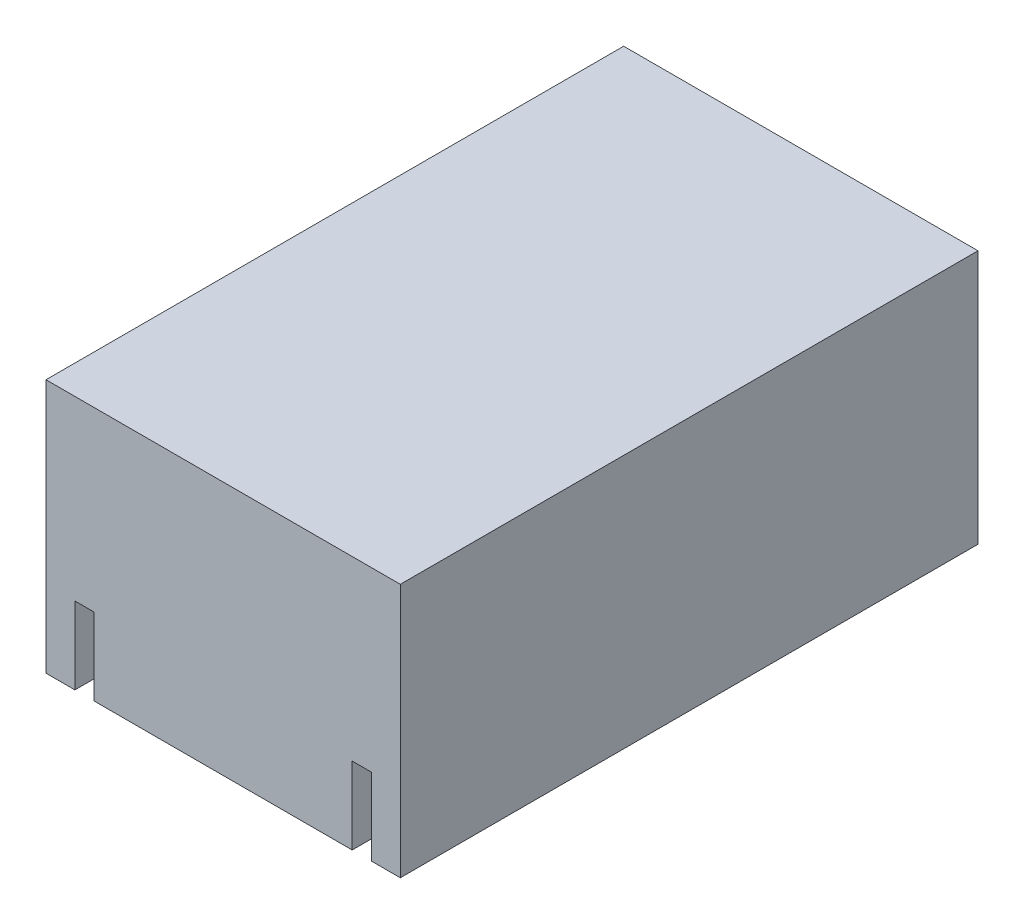
ISO-10303-21;
HEADER;
FILE_DESCRIPTION(('STEP AP214'),'2;1');
FILE_NAME('part.step','',(''),(''),'','','');
FILE_SCHEMA(('AUTOMOTIVE_DESIGN { 1 0 10303 214 1 1 1 1 }'));
ENDSEC;
DATA;
#1=APPLICATION_CONTEXT('core data for automotive mechanical design processes');
#2=APPLICATION_PROTOCOL_DEFINITION('international standard','automotive_design',2000,#1);
#3=PRODUCT_CONTEXT('',#1,'mechanical');
#4=PRODUCT('Part','Part','',(#3));
#5=PRODUCT_RELATED_PRODUCT_CATEGORY('part','',(#4));
#6=PRODUCT_DEFINITION_FORMATION('','',#4);
#7=PRODUCT_DEFINITION_CONTEXT('part definition',#1,'design');
#8=PRODUCT_DEFINITION('design','',#6,#7);
#9=PRODUCT_DEFINITION_SHAPE('','',#8);
#10=(LENGTH_UNIT() NAMED_UNIT(*) SI_UNIT(.MILLI.,.METRE.));
#11=(NAMED_UNIT(*) PLANE_ANGLE_UNIT() SI_UNIT($,.RADIAN.));
#12=(NAMED_UNIT(*) SI_UNIT($,.STERADIAN.) SOLID_ANGLE_UNIT());
#13=UNCERTAINTY_MEASURE_WITH_UNIT(LENGTH_MEASURE(1.E-05),#10,'distance_accuracy_value','');
#14=(GEOMETRIC_REPRESENTATION_CONTEXT(3) GLOBAL_UNCERTAINTY_ASSIGNED_CONTEXT((#13)) GLOBAL_UNIT_ASSIGNED_CONTEXT((#10,
#11,#12)) REPRESENTATION_CONTEXT('',''));
#15=CARTESIAN_POINT('',(0.,0.,0.));
#16=DIRECTION('',(0.,0.,1.));
#17=DIRECTION('',(1.,0.,0.));
#18=AXIS2_PLACEMENT_3D('',#15,#16,#17);
#19=CARTESIAN_POINT('',(23.,-16.5,75.));
#20=DIRECTION('',(0.,1.,0.));
#21=DIRECTION('',(-1.,0.,0.));
#22=AXIS2_PLACEMENT_3D('',#19,#20,#21);
#23=PLANE('',#22);
#24=DIRECTION('',(1.,0.,0.));
#25=VECTOR('',#24,1.);
#26=CARTESIAN_POINT('',(23.,-16.5,0.));
#27=LINE('',#26,#25);
#28=CARTESIAN_POINT('',(-16.75,-16.5,0.));
#29=VERTEX_POINT('',#28);
#30=CARTESIAN_POINT('',(16.75,-16.5,0.));
#31=VERTEX_POINT('',#30);
#32=EDGE_CURVE('E138',#29,#31,#27,.T.);
#33=ORIENTED_EDGE('',*,*,#32,.T.);
#34=DIRECTION('',(0.,0.,1.));
#35=VECTOR('',#34,1.);
#36=CARTESIAN_POINT('',(16.75,-16.5,0.));
#37=LINE('',#36,#35);
#38=CARTESIAN_POINT('',(16.75,-16.5,75.));
#39=VERTEX_POINT('',#38);
#40=EDGE_CURVE('E122',#31,#39,#37,.T.);
#41=ORIENTED_EDGE('',*,*,#40,.T.);
#42=DIRECTION('',(1.,0.,0.));
#43=VECTOR('',#42,1.);
#44=CARTESIAN_POINT('',(23.,-16.5,75.));
#45=LINE('',#44,#43);
#46=CARTESIAN_POINT('',(-16.75,-16.5,75.));
#47=VERTEX_POINT('',#46);
#48=EDGE_CURVE('E190',#47,#39,#45,.T.);
#49=ORIENTED_EDGE('',*,*,#48,.F.);
#50=DIRECTION('',(0.,0.,1.));
#51=VECTOR('',#50,1.);
#52=CARTESIAN_POINT('',(-16.75,-16.5,0.));
#53=LINE('',#52,#51);
#54=EDGE_CURVE('E144',#29,#47,#53,.T.);
#55=ORIENTED_EDGE('',*,*,#54,.F.);
#56=EDGE_LOOP('',(#33,#41,#49,#55));
#57=FACE_BOUND('',#56,.T.);
#58=ADVANCED_FACE('F33',(#57),#23,.F.);
#59=CARTESIAN_POINT('',(19.25,-16.5,75.));
#60=VERTEX_POINT('',#59);
#61=CARTESIAN_POINT('',(23.,-16.5,75.));
#62=VERTEX_POINT('',#61);
#63=EDGE_CURVE('E188',#60,#62,#45,.T.);
#64=ORIENTED_EDGE('',*,*,#63,.F.);
#65=DIRECTION('',(0.,0.,1.));
#66=VECTOR('',#65,1.);
#67=CARTESIAN_POINT('',(19.25,-16.5,0.));
#68=LINE('',#67,#66);
#69=CARTESIAN_POINT('',(19.25,-16.5,0.));
#70=VERTEX_POINT('',#69);
#71=EDGE_CURVE('E132',#70,#60,#68,.T.);
#72=ORIENTED_EDGE('',*,*,#71,.F.);
#73=CARTESIAN_POINT('',(23.,-16.5,0.));
#74=VERTEX_POINT('',#73);
#75=EDGE_CURVE('E146',#70,#74,#27,.T.);
#76=ORIENTED_EDGE('',*,*,#75,.T.);
#77=DIRECTION('',(0.,0.,-1.));
#78=VECTOR('',#77,1.);
#79=CARTESIAN_POINT('',(23.,-16.5,75.));
#80=LINE('',#79,#78);
#81=EDGE_CURVE('E41',#62,#74,#80,.T.);
#82=ORIENTED_EDGE('',*,*,#81,.F.);
#83=EDGE_LOOP('',(#64,#72,#76,#82));
#84=FACE_BOUND('',#83,.T.);
#85=ADVANCED_FACE('F203',(#84),#23,.F.);
#86=CARTESIAN_POINT('',(-23.,-16.5,75.));
#87=DIRECTION('',(1.,0.,0.));
#88=DIRECTION('',(0.,0.,-1.));
#89=AXIS2_PLACEMENT_3D('',#86,#87,#88);
#90=PLANE('',#89);
#91=DIRECTION('',(0.,-1.,0.));
#92=VECTOR('',#91,1.);
#93=CARTESIAN_POINT('',(-23.,-16.5,0.));
#94=LINE('',#93,#92);
#95=CARTESIAN_POINT('',(-23.,16.5,0.));
#96=VERTEX_POINT('',#95);
#97=CARTESIAN_POINT('',(-23.,-16.5,0.));
#98=VERTEX_POINT('',#97);
#99=EDGE_CURVE('E150',#96,#98,#94,.T.);
#100=ORIENTED_EDGE('',*,*,#99,.T.);
#101=DIRECTION('',(0.,0.,-1.));
#102=VECTOR('',#101,1.);
#103=CARTESIAN_POINT('',(-23.,-16.5,75.));
#104=LINE('',#103,#102);
#105=CARTESIAN_POINT('',(-23.,-16.5,75.));
#106=VERTEX_POINT('',#105);
#107=EDGE_CURVE('E11',#106,#98,#104,.T.);
#108=ORIENTED_EDGE('',*,*,#107,.F.);
#109=DIRECTION('',(0.,-1.,0.));
#110=VECTOR('',#109,1.);
#111=CARTESIAN_POINT('',(-23.,-16.5,75.));
#112=LINE('',#111,#110);
#113=CARTESIAN_POINT('',(-23.,16.5,75.));
#114=VERTEX_POINT('',#113);
#115=EDGE_CURVE('E157',#114,#106,#112,.T.);
#116=ORIENTED_EDGE('',*,*,#115,.F.);
#117=DIRECTION('',(0.,0.,-1.));
#118=VECTOR('',#117,1.);
#119=CARTESIAN_POINT('',(-23.,16.5,75.));
#120=LINE('',#119,#118);
#121=EDGE_CURVE('E158',#114,#96,#120,.T.);
#122=ORIENTED_EDGE('',*,*,#121,.T.);
#123=EDGE_LOOP('',(#100,#108,#116,#122));
#124=FACE_BOUND('',#123,.T.);
#125=ADVANCED_FACE('F35',(#124),#90,.F.);
#126=CARTESIAN_POINT('',(-19.25,-16.5,0.));
#127=VERTEX_POINT('',#126);
#128=EDGE_CURVE('E145',#98,#127,#27,.T.);
#129=ORIENTED_EDGE('',*,*,#128,.T.);
#130=DIRECTION('',(0.,0.,1.));
#131=VECTOR('',#130,1.);
#132=CARTESIAN_POINT('',(-19.25,-16.5,0.));
#133=LINE('',#132,#131);
#134=CARTESIAN_POINT('',(-19.25,-16.5,75.));
#135=VERTEX_POINT('',#134);
#136=EDGE_CURVE('E226',#127,#135,#133,.T.);
#137=ORIENTED_EDGE('',*,*,#136,.T.);
#138=EDGE_CURVE('E192',#106,#135,#45,.T.);
#139=ORIENTED_EDGE('',*,*,#138,.F.);
#140=ORIENTED_EDGE('',*,*,#107,.T.);
#141=EDGE_LOOP('',(#129,#137,#139,#140));
#142=FACE_BOUND('',#141,.T.);
#143=ADVANCED_FACE('F239',(#142),#23,.F.);
#144=CARTESIAN_POINT('',(23.,-16.5,75.));
#145=DIRECTION('',(-1.,0.,0.));
#146=DIRECTION('',(0.,-1.,0.));
#147=AXIS2_PLACEMENT_3D('',#144,#145,#146);
#148=PLANE('',#147);
#149=DIRECTION('',(0.,1.,0.));
#150=VECTOR('',#149,1.);
#151=CARTESIAN_POINT('',(23.,-16.5,0.));
#152=LINE('',#151,#150);
#153=CARTESIAN_POINT('',(23.,16.5,0.));
#154=VERTEX_POINT('',#153);
#155=EDGE_CURVE('E149',#74,#154,#152,.T.);
#156=ORIENTED_EDGE('',*,*,#155,.T.);
#157=DIRECTION('',(0.,0.,-1.));
#158=VECTOR('',#157,1.);
#159=CARTESIAN_POINT('',(23.,16.5,75.));
#160=LINE('',#159,#158);
#161=CARTESIAN_POINT('',(23.,16.5,75.));
#162=VERTEX_POINT('',#161);
#163=EDGE_CURVE('E161',#162,#154,#160,.T.);
#164=ORIENTED_EDGE('',*,*,#163,.F.);
#165=DIRECTION('',(0.,1.,0.));
#166=VECTOR('',#165,1.);
#167=CARTESIAN_POINT('',(23.,-16.5,75.));
#168=LINE('',#167,#166);
#169=EDGE_CURVE('E171',#62,#162,#168,.T.);
#170=ORIENTED_EDGE('',*,*,#169,.F.);
#171=ORIENTED_EDGE('',*,*,#81,.T.);
#172=EDGE_LOOP('',(#156,#164,#170,#171));
#173=FACE_BOUND('',#172,.T.);
#174=ADVANCED_FACE('F169',(#173),#148,.F.);
#175=CARTESIAN_POINT('',(23.,16.5,75.));
#176=DIRECTION('',(0.,-1.,0.));
#177=DIRECTION('',(1.,0.,0.));
#178=AXIS2_PLACEMENT_3D('',#175,#176,#177);
#179=PLANE('',#178);
#180=DIRECTION('',(-1.,0.,0.));
#181=VECTOR('',#180,1.);
#182=CARTESIAN_POINT('',(23.,16.5,0.));
#183=LINE('',#182,#181);
#184=EDGE_CURVE('E155',#154,#96,#183,.T.);
#185=ORIENTED_EDGE('',*,*,#184,.T.);
#186=ORIENTED_EDGE('',*,*,#121,.F.);
#187=DIRECTION('',(-1.,0.,0.));
#188=VECTOR('',#187,1.);
#189=CARTESIAN_POINT('',(23.,16.5,75.));
#190=LINE('',#189,#188);
#191=EDGE_CURVE('E162',#162,#114,#190,.T.);
#192=ORIENTED_EDGE('',*,*,#191,.F.);
#193=ORIENTED_EDGE('',*,*,#163,.T.);
#194=EDGE_LOOP('',(#185,#186,#192,#193));
#195=FACE_BOUND('',#194,.T.);
#196=ADVANCED_FACE('F180',(#195),#179,.F.);
#197=CARTESIAN_POINT('',(0.,0.,75.));
#198=DIRECTION('',(0.,0.,1.));
#199=DIRECTION('',(1.,0.,0.));
#200=AXIS2_PLACEMENT_3D('',#197,#198,#199);
#201=PLANE('',#200);
#202=DIRECTION('',(0.,-1.,0.));
#203=VECTOR('',#202,1.);
#204=CARTESIAN_POINT('',(16.75,-16.5,75.));
#205=LINE('',#204,#203);
#206=CARTESIAN_POINT('',(16.75,-6.5,75.));
#207=VERTEX_POINT('',#206);
#208=EDGE_CURVE('E127',#207,#39,#205,.T.);
#209=ORIENTED_EDGE('',*,*,#208,.F.);
#210=DIRECTION('',(-1.,0.,0.));
#211=VECTOR('',#210,1.);
#212=CARTESIAN_POINT('',(16.75,-6.5,75.));
#213=LINE('',#212,#211);
#214=CARTESIAN_POINT('',(19.25,-6.5,75.));
#215=VERTEX_POINT('',#214);
#216=EDGE_CURVE('E141',#215,#207,#213,.T.);
#217=ORIENTED_EDGE('',*,*,#216,.F.);
#218=DIRECTION('',(0.,1.,0.));
#219=VECTOR('',#218,1.);
#220=CARTESIAN_POINT('',(19.25,-16.5,75.));
#221=LINE('',#220,#219);
#222=EDGE_CURVE('E201',#60,#215,#221,.T.);
#223=ORIENTED_EDGE('',*,*,#222,.F.);
#224=ORIENTED_EDGE('',*,*,#63,.T.);
#225=ORIENTED_EDGE('',*,*,#169,.T.);
#226=ORIENTED_EDGE('',*,*,#191,.T.);
#227=ORIENTED_EDGE('',*,*,#115,.T.);
#228=ORIENTED_EDGE('',*,*,#138,.T.);
#229=DIRECTION('',(0.,-1.,0.));
#230=VECTOR('',#229,1.);
#231=CARTESIAN_POINT('',(-19.25,-16.5,75.));
#232=LINE('',#231,#230);
#233=CARTESIAN_POINT('',(-19.25,-6.5,75.));
#234=VERTEX_POINT('',#233);
#235=EDGE_CURVE('E214',#234,#135,#232,.T.);
#236=ORIENTED_EDGE('',*,*,#235,.F.);
#237=DIRECTION('',(-1.,0.,0.));
#238=VECTOR('',#237,1.);
#239=CARTESIAN_POINT('',(-16.75,-6.5,75.));
#240=LINE('',#239,#238);
#241=CARTESIAN_POINT('',(-16.75,-6.5,75.));
#242=VERTEX_POINT('',#241);
#243=EDGE_CURVE('E221',#242,#234,#240,.T.);
#244=ORIENTED_EDGE('',*,*,#243,.F.);
#245=DIRECTION('',(0.,1.,0.));
#246=VECTOR('',#245,1.);
#247=CARTESIAN_POINT('',(-16.75,-16.5,75.));
#248=LINE('',#247,#246);
#249=EDGE_CURVE('E218',#47,#242,#248,.T.);
#250=ORIENTED_EDGE('',*,*,#249,.F.);
#251=ORIENTED_EDGE('',*,*,#48,.T.);
#252=EDGE_LOOP('',(#209,#217,#223,#224,#225,#226,#227,#228,#236,#244,#250,#251));
#253=FACE_BOUND('',#252,.T.);
#254=ADVANCED_FACE('F197',(#253),#201,.T.);
#255=CARTESIAN_POINT('',(0.,0.,0.));
#256=DIRECTION('',(0.,0.,1.));
#257=DIRECTION('',(1.,0.,0.));
#258=AXIS2_PLACEMENT_3D('',#255,#256,#257);
#259=PLANE('',#258);
#260=DIRECTION('',(-1.,0.,0.));
#261=VECTOR('',#260,1.);
#262=CARTESIAN_POINT('',(16.75,-6.5,0.));
#263=LINE('',#262,#261);
#264=CARTESIAN_POINT('',(19.25,-6.5,0.));
#265=VERTEX_POINT('',#264);
#266=CARTESIAN_POINT('',(16.75,-6.5,0.));
#267=VERTEX_POINT('',#266);
#268=EDGE_CURVE('E48',#265,#267,#263,.T.);
#269=ORIENTED_EDGE('',*,*,#268,.T.);
#270=DIRECTION('',(0.,-1.,0.));
#271=VECTOR('',#270,1.);
#272=CARTESIAN_POINT('',(16.75,-16.5,0.));
#273=LINE('',#272,#271);
#274=EDGE_CURVE('E125',#267,#31,#273,.T.);
#275=ORIENTED_EDGE('',*,*,#274,.T.);
#276=ORIENTED_EDGE('',*,*,#32,.F.);
#277=DIRECTION('',(0.,1.,0.));
#278=VECTOR('',#277,1.);
#279=CARTESIAN_POINT('',(-16.75,-16.5,0.));
#280=LINE('',#279,#278);
#281=CARTESIAN_POINT('',(-16.75,-6.5,0.));
#282=VERTEX_POINT('',#281);
#283=EDGE_CURVE('E211',#29,#282,#280,.T.);
#284=ORIENTED_EDGE('',*,*,#283,.T.);
#285=DIRECTION('',(-1.,0.,0.));
#286=VECTOR('',#285,1.);
#287=CARTESIAN_POINT('',(-16.75,-6.5,0.));
#288=LINE('',#287,#286);
#289=CARTESIAN_POINT('',(-19.25,-6.5,0.));
#290=VERTEX_POINT('',#289);
#291=EDGE_CURVE('E213',#282,#290,#288,.T.);
#292=ORIENTED_EDGE('',*,*,#291,.T.);
#293=DIRECTION('',(0.,-1.,0.));
#294=VECTOR('',#293,1.);
#295=CARTESIAN_POINT('',(-19.25,-16.5,0.));
#296=LINE('',#295,#294);
#297=EDGE_CURVE('E56',#290,#127,#296,.T.);
#298=ORIENTED_EDGE('',*,*,#297,.T.);
#299=ORIENTED_EDGE('',*,*,#128,.F.);
#300=ORIENTED_EDGE('',*,*,#99,.F.);
#301=ORIENTED_EDGE('',*,*,#184,.F.);
#302=ORIENTED_EDGE('',*,*,#155,.F.);
#303=ORIENTED_EDGE('',*,*,#75,.F.);
#304=DIRECTION('',(0.,1.,0.));
#305=VECTOR('',#304,1.);
#306=CARTESIAN_POINT('',(19.25,-16.5,0.));
#307=LINE('',#306,#305);
#308=EDGE_CURVE('E140',#70,#265,#307,.T.);
#309=ORIENTED_EDGE('',*,*,#308,.T.);
#310=EDGE_LOOP('',(#269,#275,#276,#284,#292,#298,#299,#300,#301,#302,#303,#309));
#311=FACE_BOUND('',#310,.T.);
#312=ADVANCED_FACE('F136',(#311),#259,.F.);
#313=CARTESIAN_POINT('',(-16.75,-16.5,0.));
#314=DIRECTION('',(1.,0.,0.));
#315=DIRECTION('',(0.,1.,0.));
#316=AXIS2_PLACEMENT_3D('',#313,#314,#315);
#317=PLANE('',#316);
#318=ORIENTED_EDGE('',*,*,#249,.T.);
#319=DIRECTION('',(0.,0.,1.));
#320=VECTOR('',#319,1.);
#321=CARTESIAN_POINT('',(-16.75,-6.5,0.));
#322=LINE('',#321,#320);
#323=EDGE_CURVE('E194',#282,#242,#322,.T.);
#324=ORIENTED_EDGE('',*,*,#323,.F.);
#325=ORIENTED_EDGE('',*,*,#283,.F.);
#326=ORIENTED_EDGE('',*,*,#54,.T.);
#327=EDGE_LOOP('',(#318,#324,#325,#326));
#328=FACE_BOUND('',#327,.T.);
#329=ADVANCED_FACE('F236',(#328),#317,.F.);
#330=CARTESIAN_POINT('',(-19.25,-16.5,0.));
#331=DIRECTION('',(-1.,0.,0.));
#332=DIRECTION('',(0.,0.,1.));
#333=AXIS2_PLACEMENT_3D('',#330,#331,#332);
#334=PLANE('',#333);
#335=ORIENTED_EDGE('',*,*,#235,.T.);
#336=ORIENTED_EDGE('',*,*,#136,.F.);
#337=ORIENTED_EDGE('',*,*,#297,.F.);
#338=DIRECTION('',(0.,0.,1.));
#339=VECTOR('',#338,1.);
#340=CARTESIAN_POINT('',(-19.25,-6.5,0.));
#341=LINE('',#340,#339);
#342=EDGE_CURVE('E228',#290,#234,#341,.T.);
#343=ORIENTED_EDGE('',*,*,#342,.T.);
#344=EDGE_LOOP('',(#335,#336,#337,#343));
#345=FACE_BOUND('',#344,.T.);
#346=ADVANCED_FACE('F237',(#345),#334,.F.);
#347=CARTESIAN_POINT('',(-16.75,-6.5,0.));
#348=DIRECTION('',(0.,1.,0.));
#349=DIRECTION('',(-1.,0.,0.));
#350=AXIS2_PLACEMENT_3D('',#347,#348,#349);
#351=PLANE('',#350);
#352=ORIENTED_EDGE('',*,*,#243,.T.);
#353=ORIENTED_EDGE('',*,*,#342,.F.);
#354=ORIENTED_EDGE('',*,*,#291,.F.);
#355=ORIENTED_EDGE('',*,*,#323,.T.);
#356=EDGE_LOOP('',(#352,#353,#354,#355));
#357=FACE_BOUND('',#356,.T.);
#358=ADVANCED_FACE('F231',(#357),#351,.F.);
#359=CARTESIAN_POINT('',(16.75,-16.5,0.));
#360=DIRECTION('',(-1.,0.,0.));
#361=DIRECTION('',(0.,0.,1.));
#362=AXIS2_PLACEMENT_3D('',#359,#360,#361);
#363=PLANE('',#362);
#364=ORIENTED_EDGE('',*,*,#208,.T.);
#365=ORIENTED_EDGE('',*,*,#40,.F.);
#366=ORIENTED_EDGE('',*,*,#274,.F.);
#367=DIRECTION('',(0.,0.,1.));
#368=VECTOR('',#367,1.);
#369=CARTESIAN_POINT('',(16.75,-6.5,0.));
#370=LINE('',#369,#368);
#371=EDGE_CURVE('E207',#267,#207,#370,.T.);
#372=ORIENTED_EDGE('',*,*,#371,.T.);
#373=EDGE_LOOP('',(#364,#365,#366,#372));
#374=FACE_BOUND('',#373,.T.);
#375=ADVANCED_FACE('F124',(#374),#363,.F.);
#376=CARTESIAN_POINT('',(16.75,-6.5,0.));
#377=DIRECTION('',(0.,1.,0.));
#378=DIRECTION('',(-1.,0.,0.));
#379=AXIS2_PLACEMENT_3D('',#376,#377,#378);
#380=PLANE('',#379);
#381=ORIENTED_EDGE('',*,*,#216,.T.);
#382=ORIENTED_EDGE('',*,*,#371,.F.);
#383=ORIENTED_EDGE('',*,*,#268,.F.);
#384=DIRECTION('',(0.,0.,1.));
#385=VECTOR('',#384,1.);
#386=CARTESIAN_POINT('',(19.25,-6.5,0.));
#387=LINE('',#386,#385);
#388=EDGE_CURVE('E205',#265,#215,#387,.T.);
#389=ORIENTED_EDGE('',*,*,#388,.T.);
#390=EDGE_LOOP('',(#381,#382,#383,#389));
#391=FACE_BOUND('',#390,.T.);
#392=ADVANCED_FACE('F312',(#391),#380,.F.);
#393=CARTESIAN_POINT('',(19.25,-16.5,0.));
#394=DIRECTION('',(1.,0.,0.));
#395=DIRECTION('',(0.,1.,0.));
#396=AXIS2_PLACEMENT_3D('',#393,#394,#395);
#397=PLANE('',#396);
#398=ORIENTED_EDGE('',*,*,#222,.T.);
#399=ORIENTED_EDGE('',*,*,#388,.F.);
#400=ORIENTED_EDGE('',*,*,#308,.F.);
#401=ORIENTED_EDGE('',*,*,#71,.T.);
#402=EDGE_LOOP('',(#398,#399,#400,#401));
#403=FACE_BOUND('',#402,.T.);
#404=ADVANCED_FACE('F320',(#403),#397,.F.);
#405=CLOSED_SHELL('',(#58,#85,#125,#143,#174,#196,#254,#312,#329,#346,#358,#375,#392,#404));
#406=MANIFOLD_SOLID_BREP('B2',#405);
#407=ADVANCED_BREP_SHAPE_REPRESENTATION('',(#18,#406),#14);
#408=SHAPE_DEFINITION_REPRESENTATION(#9,#407);
ENDSEC;
END-ISO-10303-21;
